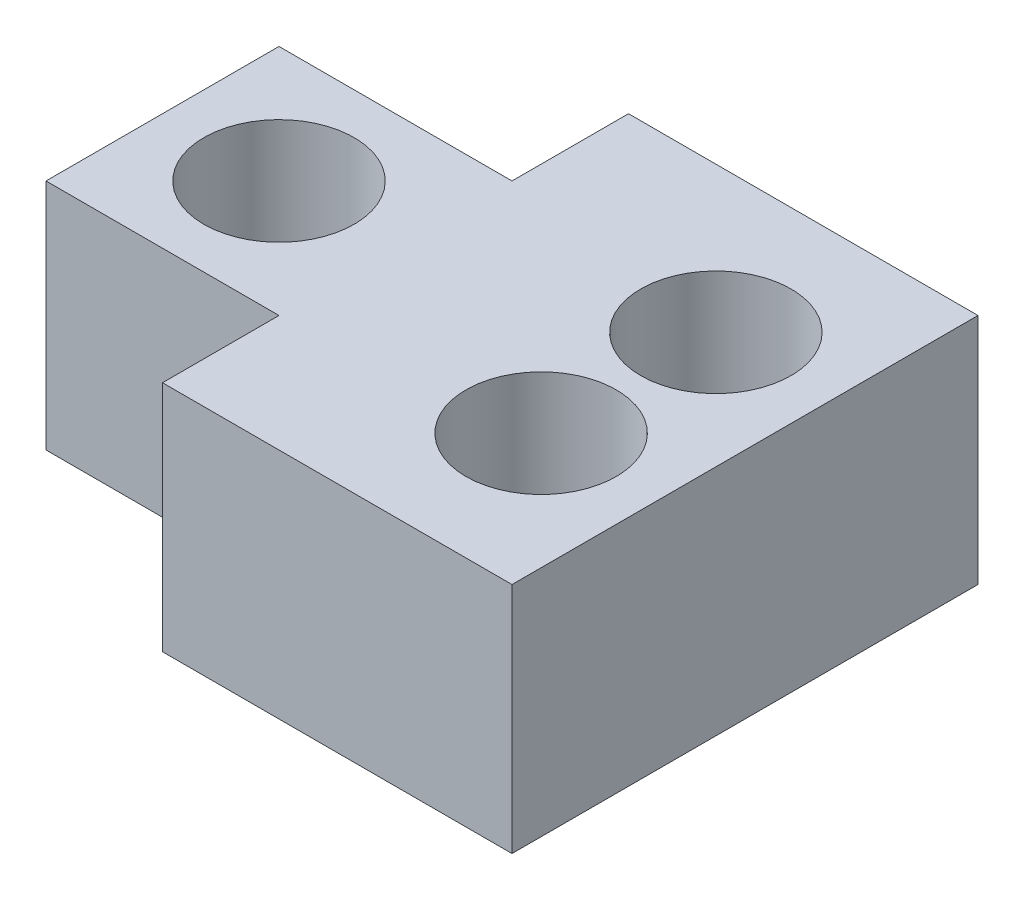
ISO-10303-21;
HEADER;
FILE_DESCRIPTION(('STEP AP214'),'2;1');
FILE_NAME('part.step','',(''),(''),'','','');
FILE_SCHEMA(('AUTOMOTIVE_DESIGN { 1 0 10303 214 1 1 1 1 }'));
ENDSEC;
DATA;
#1=APPLICATION_CONTEXT('core data for automotive mechanical design processes');
#2=APPLICATION_PROTOCOL_DEFINITION('international standard','automotive_design',2000,#1);
#3=PRODUCT_CONTEXT('',#1,'mechanical');
#4=PRODUCT('Part','Part','',(#3));
#5=PRODUCT_RELATED_PRODUCT_CATEGORY('part','',(#4));
#6=PRODUCT_DEFINITION_FORMATION('','',#4);
#7=PRODUCT_DEFINITION_CONTEXT('part definition',#1,'design');
#8=PRODUCT_DEFINITION('design','',#6,#7);
#9=PRODUCT_DEFINITION_SHAPE('','',#8);
#10=(LENGTH_UNIT() NAMED_UNIT(*) SI_UNIT(.MILLI.,.METRE.));
#11=(NAMED_UNIT(*) PLANE_ANGLE_UNIT() SI_UNIT($,.RADIAN.));
#12=(NAMED_UNIT(*) SI_UNIT($,.STERADIAN.) SOLID_ANGLE_UNIT());
#13=UNCERTAINTY_MEASURE_WITH_UNIT(LENGTH_MEASURE(1.E-05),#10,'distance_accuracy_value','');
#14=(GEOMETRIC_REPRESENTATION_CONTEXT(3) GLOBAL_UNCERTAINTY_ASSIGNED_CONTEXT((#13)) GLOBAL_UNIT_ASSIGNED_CONTEXT((#10,
#11,#12)) REPRESENTATION_CONTEXT('',''));
#15=CARTESIAN_POINT('',(0.,0.,0.));
#16=DIRECTION('',(0.,0.,1.));
#17=DIRECTION('',(1.,0.,0.));
#18=AXIS2_PLACEMENT_3D('',#15,#16,#17);
#19=CARTESIAN_POINT('',(16.9435297558122,20.,0.));
#20=DIRECTION('',(1.,0.,0.));
#21=DIRECTION('',(0.,0.,-1.));
#22=AXIS2_PLACEMENT_3D('',#19,#20,#21);
#23=PLANE('',#22);
#24=DIRECTION('',(0.,0.,1.));
#25=VECTOR('',#24,1.);
#26=CARTESIAN_POINT('',(16.9435297558122,0.,0.));
#27=LINE('',#26,#25);
#28=CARTESIAN_POINT('',(16.9435297558122,0.,-18.9135838572891));
#29=VERTEX_POINT('',#28);
#30=CARTESIAN_POINT('',(16.9435297558123,0.,21.0864161427109));
#31=VERTEX_POINT('',#30);
#32=EDGE_CURVE('E182',#29,#31,#27,.T.);
#33=ORIENTED_EDGE('',*,*,#32,.F.);
#34=DIRECTION('',(0.,-1.,0.));
#35=VECTOR('',#34,1.);
#36=CARTESIAN_POINT('',(16.9435297558122,20.,-18.9135838572891));
#37=LINE('',#36,#35);
#38=CARTESIAN_POINT('',(16.9435297558122,20.,-18.9135838572891));
#39=VERTEX_POINT('',#38);
#40=EDGE_CURVE('E11',#39,#29,#37,.T.);
#41=ORIENTED_EDGE('',*,*,#40,.F.);
#42=DIRECTION('',(0.,0.,1.));
#43=VECTOR('',#42,1.);
#44=CARTESIAN_POINT('',(16.9435297558122,20.,0.));
#45=LINE('',#44,#43);
#46=CARTESIAN_POINT('',(16.9435297558123,20.,21.0864161427109));
#47=VERTEX_POINT('',#46);
#48=EDGE_CURVE('E268',#39,#47,#45,.T.);
#49=ORIENTED_EDGE('',*,*,#48,.T.);
#50=DIRECTION('',(0.,-1.,0.));
#51=VECTOR('',#50,1.);
#52=CARTESIAN_POINT('',(16.9435297558123,20.,21.0864161427109));
#53=LINE('',#52,#51);
#54=EDGE_CURVE('E99',#47,#31,#53,.T.);
#55=ORIENTED_EDGE('',*,*,#54,.T.);
#56=EDGE_LOOP('',(#33,#41,#49,#55));
#57=FACE_BOUND('',#56,.T.);
#58=ADVANCED_FACE('F47',(#57),#23,.T.);
#59=CARTESIAN_POINT('',(0.,20.,-18.9135838572891));
#60=DIRECTION('',(0.,0.,-1.));
#61=DIRECTION('',(-1.,0.,0.));
#62=AXIS2_PLACEMENT_3D('',#59,#60,#61);
#63=PLANE('',#62);
#64=DIRECTION('',(1.,0.,0.));
#65=VECTOR('',#64,1.);
#66=CARTESIAN_POINT('',(0.,0.,-18.9135838572891));
#67=LINE('',#66,#65);
#68=CARTESIAN_POINT('',(-13.0564702441878,0.,-18.9135838572891));
#69=VERTEX_POINT('',#68);
#70=EDGE_CURVE('E173',#69,#29,#67,.T.);
#71=ORIENTED_EDGE('',*,*,#70,.F.);
#72=DIRECTION('',(0.,-1.,0.));
#73=VECTOR('',#72,1.);
#74=CARTESIAN_POINT('',(-13.0564702441878,20.,-18.9135838572891));
#75=LINE('',#74,#73);
#76=CARTESIAN_POINT('',(-13.0564702441878,20.,-18.9135838572891));
#77=VERTEX_POINT('',#76);
#78=EDGE_CURVE('E57',#77,#69,#75,.T.);
#79=ORIENTED_EDGE('',*,*,#78,.F.);
#80=DIRECTION('',(1.,0.,0.));
#81=VECTOR('',#80,1.);
#82=CARTESIAN_POINT('',(0.,20.,-18.9135838572891));
#83=LINE('',#82,#81);
#84=EDGE_CURVE('E272',#77,#39,#83,.T.);
#85=ORIENTED_EDGE('',*,*,#84,.T.);
#86=ORIENTED_EDGE('',*,*,#40,.T.);
#87=EDGE_LOOP('',(#71,#79,#85,#86));
#88=FACE_BOUND('',#87,.T.);
#89=ADVANCED_FACE('F180',(#88),#63,.T.);
#90=CARTESIAN_POINT('',(-13.0564702441877,20.,0.));
#91=DIRECTION('',(1.,0.,0.));
#92=DIRECTION('',(0.,0.,-1.));
#93=AXIS2_PLACEMENT_3D('',#90,#91,#92);
#94=PLANE('',#93);
#95=DIRECTION('',(0.,0.,1.));
#96=VECTOR('',#95,1.);
#97=CARTESIAN_POINT('',(-13.0564702441877,0.,0.));
#98=LINE('',#97,#96);
#99=CARTESIAN_POINT('',(-13.0564702441878,0.,-8.91358385728908));
#100=VERTEX_POINT('',#99);
#101=EDGE_CURVE('E164',#69,#100,#98,.T.);
#102=ORIENTED_EDGE('',*,*,#101,.T.);
#103=DIRECTION('',(0.,-1.,0.));
#104=VECTOR('',#103,1.);
#105=CARTESIAN_POINT('',(-13.0564702441878,20.,-8.91358385728908));
#106=LINE('',#105,#104);
#107=CARTESIAN_POINT('',(-13.0564702441878,20.,-8.91358385728908));
#108=VERTEX_POINT('',#107);
#109=EDGE_CURVE('E155',#108,#100,#106,.T.);
#110=ORIENTED_EDGE('',*,*,#109,.F.);
#111=DIRECTION('',(0.,0.,1.));
#112=VECTOR('',#111,1.);
#113=CARTESIAN_POINT('',(-13.0564702441877,20.,0.));
#114=LINE('',#113,#112);
#115=EDGE_CURVE('E129',#77,#108,#114,.T.);
#116=ORIENTED_EDGE('',*,*,#115,.F.);
#117=ORIENTED_EDGE('',*,*,#78,.T.);
#118=EDGE_LOOP('',(#102,#110,#116,#117));
#119=FACE_BOUND('',#118,.T.);
#120=ADVANCED_FACE('F162',(#119),#94,.F.);
#121=CARTESIAN_POINT('',(0.,20.,-8.91358385728908));
#122=DIRECTION('',(0.,0.,-1.));
#123=DIRECTION('',(-1.,0.,0.));
#124=AXIS2_PLACEMENT_3D('',#121,#122,#123);
#125=PLANE('',#124);
#126=DIRECTION('',(1.,0.,0.));
#127=VECTOR('',#126,1.);
#128=CARTESIAN_POINT('',(0.,0.,-8.91358385728908));
#129=LINE('',#128,#127);
#130=CARTESIAN_POINT('',(-33.0564702441878,0.,-8.91358385728908));
#131=VERTEX_POINT('',#130);
#132=EDGE_CURVE('E176',#131,#100,#129,.T.);
#133=ORIENTED_EDGE('',*,*,#132,.F.);
#134=DIRECTION('',(0.,-1.,0.));
#135=VECTOR('',#134,1.);
#136=CARTESIAN_POINT('',(-33.0564702441878,20.,-8.91358385728908));
#137=LINE('',#136,#135);
#138=CARTESIAN_POINT('',(-33.0564702441878,20.,-8.91358385728908));
#139=VERTEX_POINT('',#138);
#140=EDGE_CURVE('E148',#139,#131,#137,.T.);
#141=ORIENTED_EDGE('',*,*,#140,.F.);
#142=DIRECTION('',(1.,0.,0.));
#143=VECTOR('',#142,1.);
#144=CARTESIAN_POINT('',(0.,20.,-8.91358385728908));
#145=LINE('',#144,#143);
#146=EDGE_CURVE('E279',#139,#108,#145,.T.);
#147=ORIENTED_EDGE('',*,*,#146,.T.);
#148=ORIENTED_EDGE('',*,*,#109,.T.);
#149=EDGE_LOOP('',(#133,#141,#147,#148));
#150=FACE_BOUND('',#149,.T.);
#151=ADVANCED_FACE('F241',(#150),#125,.T.);
#152=CARTESIAN_POINT('',(-33.0564702441878,20.,0.));
#153=DIRECTION('',(1.,0.,0.));
#154=DIRECTION('',(0.,0.,-1.));
#155=AXIS2_PLACEMENT_3D('',#152,#153,#154);
#156=PLANE('',#155);
#157=DIRECTION('',(0.,0.,1.));
#158=VECTOR('',#157,1.);
#159=CARTESIAN_POINT('',(-33.0564702441878,0.,0.));
#160=LINE('',#159,#158);
#161=CARTESIAN_POINT('',(-33.0564702441878,0.,11.0864161427109));
#162=VERTEX_POINT('',#161);
#163=EDGE_CURVE('E191',#131,#162,#160,.T.);
#164=ORIENTED_EDGE('',*,*,#163,.T.);
#165=DIRECTION('',(0.,-1.,0.));
#166=VECTOR('',#165,1.);
#167=CARTESIAN_POINT('',(-33.0564702441878,20.,11.0864161427109));
#168=LINE('',#167,#166);
#169=CARTESIAN_POINT('',(-33.0564702441878,20.,11.0864161427109));
#170=VERTEX_POINT('',#169);
#171=EDGE_CURVE('E144',#170,#162,#168,.T.);
#172=ORIENTED_EDGE('',*,*,#171,.F.);
#173=DIRECTION('',(0.,0.,1.));
#174=VECTOR('',#173,1.);
#175=CARTESIAN_POINT('',(-33.0564702441878,20.,0.));
#176=LINE('',#175,#174);
#177=EDGE_CURVE('E135',#139,#170,#176,.T.);
#178=ORIENTED_EDGE('',*,*,#177,.F.);
#179=ORIENTED_EDGE('',*,*,#140,.T.);
#180=EDGE_LOOP('',(#164,#172,#178,#179));
#181=FACE_BOUND('',#180,.T.);
#182=ADVANCED_FACE('F244',(#181),#156,.F.);
#183=CARTESIAN_POINT('',(0.,20.,11.0864161427109));
#184=DIRECTION('',(0.,0.,-1.));
#185=DIRECTION('',(-1.,0.,0.));
#186=AXIS2_PLACEMENT_3D('',#183,#184,#185);
#187=PLANE('',#186);
#188=DIRECTION('',(1.,0.,0.));
#189=VECTOR('',#188,1.);
#190=CARTESIAN_POINT('',(0.,0.,11.0864161427109));
#191=LINE('',#190,#189);
#192=CARTESIAN_POINT('',(-13.0564702441877,0.,11.0864161427109));
#193=VERTEX_POINT('',#192);
#194=EDGE_CURVE('E142',#162,#193,#191,.T.);
#195=ORIENTED_EDGE('',*,*,#194,.T.);
#196=DIRECTION('',(0.,-1.,0.));
#197=VECTOR('',#196,1.);
#198=CARTESIAN_POINT('',(-13.0564702441877,20.,11.0864161427109));
#199=LINE('',#198,#197);
#200=CARTESIAN_POINT('',(-13.0564702441877,20.,11.0864161427109));
#201=VERTEX_POINT('',#200);
#202=EDGE_CURVE('E123',#201,#193,#199,.T.);
#203=ORIENTED_EDGE('',*,*,#202,.F.);
#204=DIRECTION('',(1.,0.,0.));
#205=VECTOR('',#204,1.);
#206=CARTESIAN_POINT('',(0.,20.,11.0864161427109));
#207=LINE('',#206,#205);
#208=EDGE_CURVE('E127',#170,#201,#207,.T.);
#209=ORIENTED_EDGE('',*,*,#208,.F.);
#210=ORIENTED_EDGE('',*,*,#171,.T.);
#211=EDGE_LOOP('',(#195,#203,#209,#210));
#212=FACE_BOUND('',#211,.T.);
#213=ADVANCED_FACE('F141',(#212),#187,.F.);
#214=CARTESIAN_POINT('',(-13.0564702441877,0.,21.0864161427109));
#215=VERTEX_POINT('',#214);
#216=EDGE_CURVE('E179',#193,#215,#98,.T.);
#217=ORIENTED_EDGE('',*,*,#216,.T.);
#218=DIRECTION('',(0.,-1.,0.));
#219=VECTOR('',#218,1.);
#220=CARTESIAN_POINT('',(-13.0564702441877,20.,21.0864161427109));
#221=LINE('',#220,#219);
#222=CARTESIAN_POINT('',(-13.0564702441877,20.,21.0864161427109));
#223=VERTEX_POINT('',#222);
#224=EDGE_CURVE('E125',#223,#215,#221,.T.);
#225=ORIENTED_EDGE('',*,*,#224,.F.);
#226=EDGE_CURVE('E118',#201,#223,#114,.T.);
#227=ORIENTED_EDGE('',*,*,#226,.F.);
#228=ORIENTED_EDGE('',*,*,#202,.T.);
#229=EDGE_LOOP('',(#217,#225,#227,#228));
#230=FACE_BOUND('',#229,.T.);
#231=ADVANCED_FACE('F121',(#230),#94,.F.);
#232=CARTESIAN_POINT('',(0.,20.,21.0864161427109));
#233=DIRECTION('',(0.,0.,-1.));
#234=DIRECTION('',(-1.,0.,0.));
#235=AXIS2_PLACEMENT_3D('',#232,#233,#234);
#236=PLANE('',#235);
#237=DIRECTION('',(1.,0.,0.));
#238=VECTOR('',#237,1.);
#239=CARTESIAN_POINT('',(0.,0.,21.0864161427109));
#240=LINE('',#239,#238);
#241=EDGE_CURVE('E92',#215,#31,#240,.T.);
#242=ORIENTED_EDGE('',*,*,#241,.T.);
#243=ORIENTED_EDGE('',*,*,#54,.F.);
#244=DIRECTION('',(1.,0.,0.));
#245=VECTOR('',#244,1.);
#246=CARTESIAN_POINT('',(0.,20.,21.0864161427109));
#247=LINE('',#246,#245);
#248=EDGE_CURVE('E65',#223,#47,#247,.T.);
#249=ORIENTED_EDGE('',*,*,#248,.F.);
#250=ORIENTED_EDGE('',*,*,#224,.T.);
#251=EDGE_LOOP('',(#242,#243,#249,#250));
#252=FACE_BOUND('',#251,.T.);
#253=ADVANCED_FACE('F223',(#252),#236,.F.);
#254=CARTESIAN_POINT('',(6.94352975581224,20.,-6.41358385728908));
#255=DIRECTION('',(0.,-1.,0.));
#256=DIRECTION('',(0.,0.,-1.));
#257=AXIS2_PLACEMENT_3D('',#254,#255,#256);
#258=CYLINDRICAL_SURFACE('',#257,6.45);
#259=CARTESIAN_POINT('',(6.94352975581224,20.,-6.41358385728908));
#260=DIRECTION('',(0.,1.,0.));
#261=DIRECTION('',(0.,0.,1.));
#262=AXIS2_PLACEMENT_3D('',#259,#260,#261);
#263=CIRCLE('',#262,6.45);
#264=CARTESIAN_POINT('',(6.94352975581224,20.,0.0364161427109282));
#265=VERTEX_POINT('',#264);
#266=EDGE_CURVE('E266',#265,#265,#263,.T.);
#267=ORIENTED_EDGE('',*,*,#266,.T.);
#268=EDGE_LOOP('',(#267));
#269=FACE_BOUND('',#268,.T.);
#270=CARTESIAN_POINT('',(6.94352975581224,0.,-6.41358385728908));
#271=DIRECTION('',(0.,1.,0.));
#272=DIRECTION('',(0.,0.,1.));
#273=AXIS2_PLACEMENT_3D('',#270,#271,#272);
#274=CIRCLE('',#273,6.45);
#275=CARTESIAN_POINT('',(6.94352975581224,0.,0.0364161427109282));
#276=VERTEX_POINT('',#275);
#277=EDGE_CURVE('E185',#276,#276,#274,.T.);
#278=ORIENTED_EDGE('',*,*,#277,.F.);
#279=EDGE_LOOP('',(#278));
#280=FACE_BOUND('',#279,.T.);
#281=ADVANCED_FACE('F221',(#269,#280),#258,.F.);
#282=CARTESIAN_POINT('',(6.94352975581225,20.,8.58641614271092));
#283=DIRECTION('',(0.,-1.,0.));
#284=DIRECTION('',(0.,0.,-1.));
#285=AXIS2_PLACEMENT_3D('',#282,#283,#284);
#286=CYLINDRICAL_SURFACE('',#285,6.45);
#287=CARTESIAN_POINT('',(6.94352975581225,20.,8.58641614271092));
#288=DIRECTION('',(0.,1.,0.));
#289=DIRECTION('',(0.,0.,1.));
#290=AXIS2_PLACEMENT_3D('',#287,#288,#289);
#291=CIRCLE('',#290,6.45);
#292=CARTESIAN_POINT('',(6.94352975581225,20.,15.0364161427109));
#293=VERTEX_POINT('',#292);
#294=EDGE_CURVE('E202',#293,#293,#291,.T.);
#295=ORIENTED_EDGE('',*,*,#294,.T.);
#296=EDGE_LOOP('',(#295));
#297=FACE_BOUND('',#296,.T.);
#298=CARTESIAN_POINT('',(6.94352975581225,0.,8.58641614271092));
#299=DIRECTION('',(0.,1.,0.));
#300=DIRECTION('',(0.,0.,1.));
#301=AXIS2_PLACEMENT_3D('',#298,#299,#300);
#302=CIRCLE('',#301,6.45);
#303=CARTESIAN_POINT('',(6.94352975581225,0.,15.0364161427109));
#304=VERTEX_POINT('',#303);
#305=EDGE_CURVE('E213',#304,#304,#302,.T.);
#306=ORIENTED_EDGE('',*,*,#305,.F.);
#307=EDGE_LOOP('',(#306));
#308=FACE_BOUND('',#307,.T.);
#309=ADVANCED_FACE('F49',(#297,#308),#286,.F.);
#310=CARTESIAN_POINT('',(-23.0564702441878,20.,1.08641614271092));
#311=DIRECTION('',(0.,-1.,0.));
#312=DIRECTION('',(0.,0.,-1.));
#313=AXIS2_PLACEMENT_3D('',#310,#311,#312);
#314=CYLINDRICAL_SURFACE('',#313,6.45);
#315=CARTESIAN_POINT('',(-23.0564702441878,20.,1.08641614271092));
#316=DIRECTION('',(0.,1.,0.));
#317=DIRECTION('',(0.,0.,1.));
#318=AXIS2_PLACEMENT_3D('',#315,#316,#317);
#319=CIRCLE('',#318,6.45);
#320=CARTESIAN_POINT('',(-23.0564702441878,20.,7.53641614271093));
#321=VERTEX_POINT('',#320);
#322=EDGE_CURVE('E204',#321,#321,#319,.T.);
#323=ORIENTED_EDGE('',*,*,#322,.T.);
#324=EDGE_LOOP('',(#323));
#325=FACE_BOUND('',#324,.T.);
#326=CARTESIAN_POINT('',(-23.0564702441878,0.,1.08641614271092));
#327=DIRECTION('',(0.,1.,0.));
#328=DIRECTION('',(0.,0.,1.));
#329=AXIS2_PLACEMENT_3D('',#326,#327,#328);
#330=CIRCLE('',#329,6.45);
#331=CARTESIAN_POINT('',(-23.0564702441878,0.,7.53641614271093));
#332=VERTEX_POINT('',#331);
#333=EDGE_CURVE('E199',#332,#332,#330,.T.);
#334=ORIENTED_EDGE('',*,*,#333,.F.);
#335=EDGE_LOOP('',(#334));
#336=FACE_BOUND('',#335,.T.);
#337=ADVANCED_FACE('F229',(#325,#336),#314,.F.);
#338=CARTESIAN_POINT('',(0.,20.,0.));
#339=DIRECTION('',(0.,1.,0.));
#340=DIRECTION('',(0.,0.,1.));
#341=AXIS2_PLACEMENT_3D('',#338,#339,#340);
#342=PLANE('',#341);
#343=ORIENTED_EDGE('',*,*,#294,.F.);
#344=EDGE_LOOP('',(#343));
#345=FACE_BOUND('',#344,.T.);
#346=ORIENTED_EDGE('',*,*,#266,.F.);
#347=EDGE_LOOP('',(#346));
#348=FACE_BOUND('',#347,.T.);
#349=ORIENTED_EDGE('',*,*,#48,.F.);
#350=ORIENTED_EDGE('',*,*,#84,.F.);
#351=ORIENTED_EDGE('',*,*,#115,.T.);
#352=ORIENTED_EDGE('',*,*,#146,.F.);
#353=ORIENTED_EDGE('',*,*,#177,.T.);
#354=ORIENTED_EDGE('',*,*,#208,.T.);
#355=ORIENTED_EDGE('',*,*,#226,.T.);
#356=ORIENTED_EDGE('',*,*,#248,.T.);
#357=EDGE_LOOP('',(#349,#350,#351,#352,#353,#354,#355,#356));
#358=FACE_BOUND('',#357,.T.);
#359=ORIENTED_EDGE('',*,*,#322,.F.);
#360=EDGE_LOOP('',(#359));
#361=FACE_BOUND('',#360,.T.);
#362=ADVANCED_FACE('F131',(#345,#348,#358,#361),#342,.T.);
#363=CARTESIAN_POINT('',(0.,0.,0.));
#364=DIRECTION('',(0.,1.,0.));
#365=DIRECTION('',(0.,0.,1.));
#366=AXIS2_PLACEMENT_3D('',#363,#364,#365);
#367=PLANE('',#366);
#368=ORIENTED_EDGE('',*,*,#305,.T.);
#369=EDGE_LOOP('',(#368));
#370=FACE_BOUND('',#369,.T.);
#371=ORIENTED_EDGE('',*,*,#277,.T.);
#372=EDGE_LOOP('',(#371));
#373=FACE_BOUND('',#372,.T.);
#374=ORIENTED_EDGE('',*,*,#32,.T.);
#375=ORIENTED_EDGE('',*,*,#241,.F.);
#376=ORIENTED_EDGE('',*,*,#216,.F.);
#377=ORIENTED_EDGE('',*,*,#194,.F.);
#378=ORIENTED_EDGE('',*,*,#163,.F.);
#379=ORIENTED_EDGE('',*,*,#132,.T.);
#380=ORIENTED_EDGE('',*,*,#101,.F.);
#381=ORIENTED_EDGE('',*,*,#70,.T.);
#382=EDGE_LOOP('',(#374,#375,#376,#377,#378,#379,#380,#381));
#383=FACE_BOUND('',#382,.T.);
#384=ORIENTED_EDGE('',*,*,#333,.T.);
#385=EDGE_LOOP('',(#384));
#386=FACE_BOUND('',#385,.T.);
#387=ADVANCED_FACE('F171',(#370,#373,#383,#386),#367,.F.);
#388=CLOSED_SHELL('',(#58,#89,#120,#151,#182,#213,#231,#253,#281,#309,#337,#362,#387));
#389=MANIFOLD_SOLID_BREP('B2',#388);
#390=ADVANCED_BREP_SHAPE_REPRESENTATION('',(#18,#389),#14);
#391=SHAPE_DEFINITION_REPRESENTATION(#9,#390);
ENDSEC;
END-ISO-10303-21;
